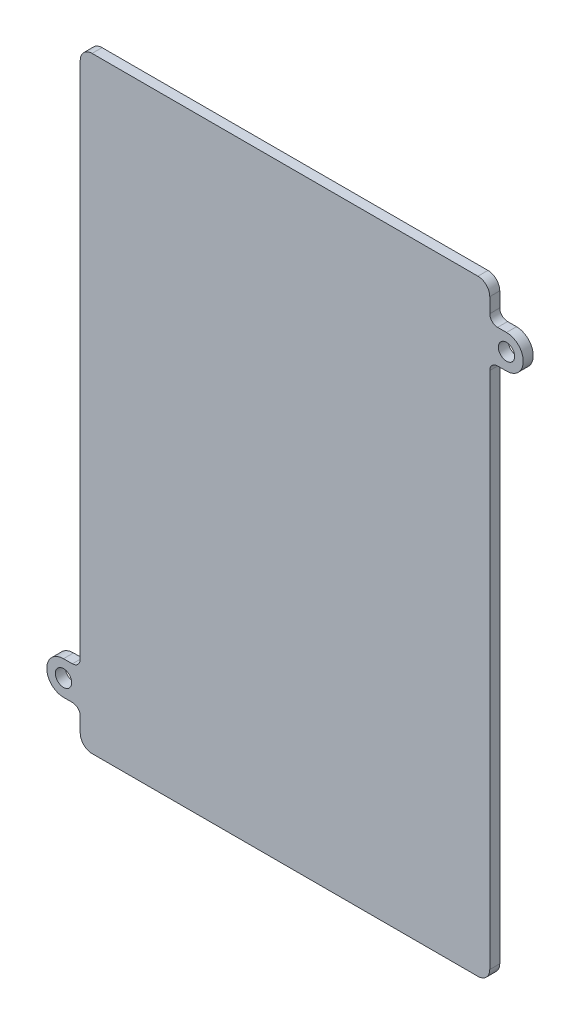
ISO-10303-21;
HEADER;
FILE_DESCRIPTION(('STEP AP214'),'2;1');
FILE_NAME('part.step','',(''),(''),'','','');
FILE_SCHEMA(('AUTOMOTIVE_DESIGN { 1 0 10303 214 1 1 1 1 }'));
ENDSEC;
DATA;
#1=APPLICATION_CONTEXT('core data for automotive mechanical design processes');
#2=APPLICATION_PROTOCOL_DEFINITION('international standard','automotive_design',2000,#1);
#3=PRODUCT_CONTEXT('',#1,'mechanical');
#4=PRODUCT('Part','Part','',(#3));
#5=PRODUCT_RELATED_PRODUCT_CATEGORY('part','',(#4));
#6=PRODUCT_DEFINITION_FORMATION('','',#4);
#7=PRODUCT_DEFINITION_CONTEXT('part definition',#1,'design');
#8=PRODUCT_DEFINITION('design','',#6,#7);
#9=PRODUCT_DEFINITION_SHAPE('','',#8);
#10=(LENGTH_UNIT() NAMED_UNIT(*) SI_UNIT(.MILLI.,.METRE.));
#11=(NAMED_UNIT(*) PLANE_ANGLE_UNIT() SI_UNIT($,.RADIAN.));
#12=(NAMED_UNIT(*) SI_UNIT($,.STERADIAN.) SOLID_ANGLE_UNIT());
#13=UNCERTAINTY_MEASURE_WITH_UNIT(LENGTH_MEASURE(1.E-05),#10,'distance_accuracy_value','');
#14=(GEOMETRIC_REPRESENTATION_CONTEXT(3) GLOBAL_UNCERTAINTY_ASSIGNED_CONTEXT((#13)) GLOBAL_UNIT_ASSIGNED_CONTEXT((#10,
#11,#12)) REPRESENTATION_CONTEXT('',''));
#15=CARTESIAN_POINT('',(0.,0.,0.));
#16=DIRECTION('',(0.,0.,1.));
#17=DIRECTION('',(1.,0.,0.));
#18=AXIS2_PLACEMENT_3D('',#15,#16,#17);
#19=CARTESIAN_POINT('',(49.,-74.,2.54));
#20=DIRECTION('',(0.,0.,-1.));
#21=DIRECTION('',(-1.,0.,0.));
#22=AXIS2_PLACEMENT_3D('',#19,#20,#21);
#23=CYLINDRICAL_SURFACE('',#22,3.);
#24=CARTESIAN_POINT('',(49.,-74.,0.));
#25=DIRECTION('',(0.,0.,1.));
#26=DIRECTION('',(1.,0.,0.));
#27=AXIS2_PLACEMENT_3D('',#24,#25,#26);
#28=CIRCLE('',#27,3.);
#29=CARTESIAN_POINT('',(49.,-77.,0.));
#30=VERTEX_POINT('',#29);
#31=CARTESIAN_POINT('',(52.,-74.,0.));
#32=VERTEX_POINT('',#31);
#33=EDGE_CURVE('E201',#30,#32,#28,.T.);
#34=ORIENTED_EDGE('',*,*,#33,.T.);
#35=DIRECTION('',(0.,0.,-1.));
#36=VECTOR('',#35,1.);
#37=CARTESIAN_POINT('',(52.,-74.,2.54));
#38=LINE('',#37,#36);
#39=CARTESIAN_POINT('',(52.,-74.,2.54));
#40=VERTEX_POINT('',#39);
#41=EDGE_CURVE('E182',#40,#32,#38,.T.);
#42=ORIENTED_EDGE('',*,*,#41,.F.);
#43=CARTESIAN_POINT('',(49.,-74.,2.54));
#44=DIRECTION('',(0.,0.,1.));
#45=DIRECTION('',(1.,0.,0.));
#46=AXIS2_PLACEMENT_3D('',#43,#44,#45);
#47=CIRCLE('',#46,3.);
#48=CARTESIAN_POINT('',(49.,-77.,2.54));
#49=VERTEX_POINT('',#48);
#50=EDGE_CURVE('E188',#49,#40,#47,.T.);
#51=ORIENTED_EDGE('',*,*,#50,.F.);
#52=DIRECTION('',(0.,0.,-1.));
#53=VECTOR('',#52,1.);
#54=CARTESIAN_POINT('',(49.,-77.,2.54));
#55=LINE('',#54,#53);
#56=EDGE_CURVE('E337',#49,#30,#55,.T.);
#57=ORIENTED_EDGE('',*,*,#56,.T.);
#58=EDGE_LOOP('',(#34,#42,#51,#57));
#59=FACE_BOUND('',#58,.T.);
#60=ADVANCED_FACE('F44',(#59),#23,.T.);
#61=CARTESIAN_POINT('',(52.,-74.,2.54));
#62=DIRECTION('',(-1.,0.,0.));
#63=DIRECTION('',(0.,0.,1.));
#64=AXIS2_PLACEMENT_3D('',#61,#62,#63);
#65=PLANE('',#64);
#66=DIRECTION('',(0.,1.,0.));
#67=VECTOR('',#66,1.);
#68=CARTESIAN_POINT('',(52.,-74.,0.));
#69=LINE('',#68,#67);
#70=CARTESIAN_POINT('',(52.,57.75,0.));
#71=VERTEX_POINT('',#70);
#72=EDGE_CURVE('E412',#32,#71,#69,.T.);
#73=ORIENTED_EDGE('',*,*,#72,.T.);
#74=DIRECTION('',(0.,0.,-1.));
#75=VECTOR('',#74,1.);
#76=CARTESIAN_POINT('',(52.,57.75,2.54));
#77=LINE('',#76,#75);
#78=CARTESIAN_POINT('',(52.,57.75,2.54));
#79=VERTEX_POINT('',#78);
#80=EDGE_CURVE('E60',#71,#79,#77,.F.);
#81=ORIENTED_EDGE('',*,*,#80,.T.);
#82=DIRECTION('',(0.,1.,0.));
#83=VECTOR('',#82,1.);
#84=CARTESIAN_POINT('',(52.,-74.,2.54));
#85=LINE('',#84,#83);
#86=EDGE_CURVE('E178',#40,#79,#85,.T.);
#87=ORIENTED_EDGE('',*,*,#86,.F.);
#88=ORIENTED_EDGE('',*,*,#41,.T.);
#89=EDGE_LOOP('',(#73,#81,#87,#88));
#90=FACE_BOUND('',#89,.T.);
#91=ADVANCED_FACE('F180',(#90),#65,.F.);
#92=CARTESIAN_POINT('',(52.,59.75,2.54));
#93=DIRECTION('',(0.,1.,0.));
#94=DIRECTION('',(0.,0.,1.));
#95=AXIS2_PLACEMENT_3D('',#92,#93,#94);
#96=PLANE('',#95);
#97=DIRECTION('',(1.,0.,0.));
#98=VECTOR('',#97,1.);
#99=CARTESIAN_POINT('',(52.,59.75,2.54));
#100=LINE('',#99,#98);
#101=CARTESIAN_POINT('',(54.,59.75,2.54));
#102=VERTEX_POINT('',#101);
#103=CARTESIAN_POINT('',(56.25,59.75,2.54));
#104=VERTEX_POINT('',#103);
#105=EDGE_CURVE('E187',#102,#104,#100,.T.);
#106=ORIENTED_EDGE('',*,*,#105,.F.);
#107=DIRECTION('',(0.,0.,-1.));
#108=VECTOR('',#107,1.);
#109=CARTESIAN_POINT('',(54.,59.75,0.));
#110=LINE('',#109,#108);
#111=CARTESIAN_POINT('',(54.,59.75,0.));
#112=VERTEX_POINT('',#111);
#113=EDGE_CURVE('E241',#102,#112,#110,.T.);
#114=ORIENTED_EDGE('',*,*,#113,.T.);
#115=DIRECTION('',(1.,0.,0.));
#116=VECTOR('',#115,1.);
#117=CARTESIAN_POINT('',(52.,59.75,0.));
#118=LINE('',#117,#116);
#119=CARTESIAN_POINT('',(56.25,59.75,0.));
#120=VERTEX_POINT('',#119);
#121=EDGE_CURVE('E303',#112,#120,#118,.T.);
#122=ORIENTED_EDGE('',*,*,#121,.T.);
#123=DIRECTION('',(0.,0.,-1.));
#124=VECTOR('',#123,1.);
#125=CARTESIAN_POINT('',(56.25,59.75,2.54));
#126=LINE('',#125,#124);
#127=EDGE_CURVE('E204',#104,#120,#126,.T.);
#128=ORIENTED_EDGE('',*,*,#127,.F.);
#129=EDGE_LOOP('',(#106,#114,#122,#128));
#130=FACE_BOUND('',#129,.T.);
#131=ADVANCED_FACE('F416',(#130),#96,.F.);
#132=CARTESIAN_POINT('',(56.25,64.,2.54));
#133=DIRECTION('',(0.,0.,-1.));
#134=DIRECTION('',(-1.,0.,0.));
#135=AXIS2_PLACEMENT_3D('',#132,#133,#134);
#136=CYLINDRICAL_SURFACE('',#135,4.25);
#137=CARTESIAN_POINT('',(56.25,64.,0.));
#138=DIRECTION('',(0.,0.,1.));
#139=DIRECTION('',(1.,0.,0.));
#140=AXIS2_PLACEMENT_3D('',#137,#138,#139);
#141=CIRCLE('',#140,4.25);
#142=CARTESIAN_POINT('',(56.25,68.25,0.));
#143=VERTEX_POINT('',#142);
#144=EDGE_CURVE('E297',#120,#143,#141,.T.);
#145=ORIENTED_EDGE('',*,*,#144,.T.);
#146=DIRECTION('',(0.,0.,-1.));
#147=VECTOR('',#146,1.);
#148=CARTESIAN_POINT('',(56.25,68.25,2.54));
#149=LINE('',#148,#147);
#150=CARTESIAN_POINT('',(56.25,68.25,2.54));
#151=VERTEX_POINT('',#150);
#152=EDGE_CURVE('E212',#151,#143,#149,.T.);
#153=ORIENTED_EDGE('',*,*,#152,.F.);
#154=CARTESIAN_POINT('',(56.25,64.,2.54));
#155=DIRECTION('',(0.,0.,1.));
#156=DIRECTION('',(1.,0.,0.));
#157=AXIS2_PLACEMENT_3D('',#154,#155,#156);
#158=CIRCLE('',#157,4.25);
#159=EDGE_CURVE('E402',#104,#151,#158,.T.);
#160=ORIENTED_EDGE('',*,*,#159,.F.);
#161=ORIENTED_EDGE('',*,*,#127,.T.);
#162=EDGE_LOOP('',(#145,#153,#160,#161));
#163=FACE_BOUND('',#162,.T.);
#164=ADVANCED_FACE('F420',(#163),#136,.T.);
#165=CARTESIAN_POINT('',(56.25,68.25,2.54));
#166=DIRECTION('',(0.,-1.,0.));
#167=DIRECTION('',(0.,0.,-1.));
#168=AXIS2_PLACEMENT_3D('',#165,#166,#167);
#169=PLANE('',#168);
#170=DIRECTION('',(-1.,0.,0.));
#171=VECTOR('',#170,1.);
#172=CARTESIAN_POINT('',(56.25,68.25,0.));
#173=LINE('',#172,#171);
#174=CARTESIAN_POINT('',(54.,68.25,0.));
#175=VERTEX_POINT('',#174);
#176=EDGE_CURVE('E289',#143,#175,#173,.T.);
#177=ORIENTED_EDGE('',*,*,#176,.T.);
#178=DIRECTION('',(0.,0.,-1.));
#179=VECTOR('',#178,1.);
#180=CARTESIAN_POINT('',(54.,68.25,2.54));
#181=LINE('',#180,#179);
#182=CARTESIAN_POINT('',(54.,68.25,2.54));
#183=VERTEX_POINT('',#182);
#184=EDGE_CURVE('E238',#175,#183,#181,.F.);
#185=ORIENTED_EDGE('',*,*,#184,.T.);
#186=DIRECTION('',(-1.,0.,0.));
#187=VECTOR('',#186,1.);
#188=CARTESIAN_POINT('',(56.25,68.25,2.54));
#189=LINE('',#188,#187);
#190=EDGE_CURVE('E271',#151,#183,#189,.T.);
#191=ORIENTED_EDGE('',*,*,#190,.F.);
#192=ORIENTED_EDGE('',*,*,#152,.T.);
#193=EDGE_LOOP('',(#177,#185,#191,#192));
#194=FACE_BOUND('',#193,.T.);
#195=ADVANCED_FACE('F294',(#194),#169,.F.);
#196=CARTESIAN_POINT('',(52.,68.25,2.54));
#197=DIRECTION('',(-1.,0.,0.));
#198=DIRECTION('',(0.,0.,1.));
#199=AXIS2_PLACEMENT_3D('',#196,#197,#198);
#200=PLANE('',#199);
#201=DIRECTION('',(0.,1.,0.));
#202=VECTOR('',#201,1.);
#203=CARTESIAN_POINT('',(52.,68.25,2.54));
#204=LINE('',#203,#202);
#205=CARTESIAN_POINT('',(52.,70.25,2.54));
#206=VERTEX_POINT('',#205);
#207=CARTESIAN_POINT('',(52.,74.,2.54));
#208=VERTEX_POINT('',#207);
#209=EDGE_CURVE('E268',#206,#208,#204,.T.);
#210=ORIENTED_EDGE('',*,*,#209,.F.);
#211=DIRECTION('',(0.,0.,-1.));
#212=VECTOR('',#211,1.);
#213=CARTESIAN_POINT('',(52.,70.25,0.));
#214=LINE('',#213,#212);
#215=CARTESIAN_POINT('',(52.,70.25,0.));
#216=VERTEX_POINT('',#215);
#217=EDGE_CURVE('E234',#206,#216,#214,.T.);
#218=ORIENTED_EDGE('',*,*,#217,.T.);
#219=DIRECTION('',(0.,1.,0.));
#220=VECTOR('',#219,1.);
#221=CARTESIAN_POINT('',(52.,68.25,0.));
#222=LINE('',#221,#220);
#223=CARTESIAN_POINT('',(52.,74.,0.));
#224=VERTEX_POINT('',#223);
#225=EDGE_CURVE('E291',#216,#224,#222,.T.);
#226=ORIENTED_EDGE('',*,*,#225,.T.);
#227=DIRECTION('',(0.,0.,-1.));
#228=VECTOR('',#227,1.);
#229=CARTESIAN_POINT('',(52.,74.,2.54));
#230=LINE('',#229,#228);
#231=EDGE_CURVE('E279',#208,#224,#230,.T.);
#232=ORIENTED_EDGE('',*,*,#231,.F.);
#233=EDGE_LOOP('',(#210,#218,#226,#232));
#234=FACE_BOUND('',#233,.T.);
#235=ADVANCED_FACE('F276',(#234),#200,.F.);
#236=CARTESIAN_POINT('',(49.,74.,2.54));
#237=DIRECTION('',(0.,0.,-1.));
#238=DIRECTION('',(-1.,0.,0.));
#239=AXIS2_PLACEMENT_3D('',#236,#237,#238);
#240=CYLINDRICAL_SURFACE('',#239,3.);
#241=CARTESIAN_POINT('',(49.,74.,0.));
#242=DIRECTION('',(0.,0.,1.));
#243=DIRECTION('',(1.,0.,0.));
#244=AXIS2_PLACEMENT_3D('',#241,#242,#243);
#245=CIRCLE('',#244,3.);
#246=CARTESIAN_POINT('',(49.,77.,0.));
#247=VERTEX_POINT('',#246);
#248=EDGE_CURVE('E301',#224,#247,#245,.T.);
#249=ORIENTED_EDGE('',*,*,#248,.T.);
#250=DIRECTION('',(0.,0.,-1.));
#251=VECTOR('',#250,1.);
#252=CARTESIAN_POINT('',(49.,77.,2.54));
#253=LINE('',#252,#251);
#254=CARTESIAN_POINT('',(49.,77.,2.54));
#255=VERTEX_POINT('',#254);
#256=EDGE_CURVE('E364',#255,#247,#253,.T.);
#257=ORIENTED_EDGE('',*,*,#256,.F.);
#258=CARTESIAN_POINT('',(49.,74.,2.54));
#259=DIRECTION('',(0.,0.,1.));
#260=DIRECTION('',(1.,0.,0.));
#261=AXIS2_PLACEMENT_3D('',#258,#259,#260);
#262=CIRCLE('',#261,3.);
#263=EDGE_CURVE('E282',#208,#255,#262,.T.);
#264=ORIENTED_EDGE('',*,*,#263,.F.);
#265=ORIENTED_EDGE('',*,*,#231,.T.);
#266=EDGE_LOOP('',(#249,#257,#264,#265));
#267=FACE_BOUND('',#266,.T.);
#268=ADVANCED_FACE('F597',(#267),#240,.T.);
#269=CARTESIAN_POINT('',(49.,77.,2.54));
#270=DIRECTION('',(0.,-1.,0.));
#271=DIRECTION('',(0.,0.,-1.));
#272=AXIS2_PLACEMENT_3D('',#269,#270,#271);
#273=PLANE('',#272);
#274=DIRECTION('',(-1.,0.,0.));
#275=VECTOR('',#274,1.);
#276=CARTESIAN_POINT('',(49.,77.,0.));
#277=LINE('',#276,#275);
#278=CARTESIAN_POINT('',(-49.,77.,0.));
#279=VERTEX_POINT('',#278);
#280=EDGE_CURVE('E309',#247,#279,#277,.T.);
#281=ORIENTED_EDGE('',*,*,#280,.T.);
#282=DIRECTION('',(0.,0.,-1.));
#283=VECTOR('',#282,1.);
#284=CARTESIAN_POINT('',(-49.,77.,2.54));
#285=LINE('',#284,#283);
#286=CARTESIAN_POINT('',(-49.,77.,2.54));
#287=VERTEX_POINT('',#286);
#288=EDGE_CURVE('E360',#287,#279,#285,.T.);
#289=ORIENTED_EDGE('',*,*,#288,.F.);
#290=DIRECTION('',(-1.,0.,0.));
#291=VECTOR('',#290,1.);
#292=CARTESIAN_POINT('',(49.,77.,2.54));
#293=LINE('',#292,#291);
#294=EDGE_CURVE('E395',#255,#287,#293,.T.);
#295=ORIENTED_EDGE('',*,*,#294,.F.);
#296=ORIENTED_EDGE('',*,*,#256,.T.);
#297=EDGE_LOOP('',(#281,#289,#295,#296));
#298=FACE_BOUND('',#297,.T.);
#299=ADVANCED_FACE('F587',(#298),#273,.F.);
#300=CARTESIAN_POINT('',(-49.,74.,2.54));
#301=DIRECTION('',(0.,0.,-1.));
#302=DIRECTION('',(-1.,0.,0.));
#303=AXIS2_PLACEMENT_3D('',#300,#301,#302);
#304=CYLINDRICAL_SURFACE('',#303,3.);
#305=CARTESIAN_POINT('',(-49.,74.,0.));
#306=DIRECTION('',(0.,0.,1.));
#307=DIRECTION('',(1.,0.,0.));
#308=AXIS2_PLACEMENT_3D('',#305,#306,#307);
#309=CIRCLE('',#308,3.);
#310=CARTESIAN_POINT('',(-52.,74.,0.));
#311=VERTEX_POINT('',#310);
#312=EDGE_CURVE('E312',#279,#311,#309,.T.);
#313=ORIENTED_EDGE('',*,*,#312,.T.);
#314=DIRECTION('',(0.,0.,-1.));
#315=VECTOR('',#314,1.);
#316=CARTESIAN_POINT('',(-52.,74.,2.54));
#317=LINE('',#316,#315);
#318=CARTESIAN_POINT('',(-52.,74.,2.54));
#319=VERTEX_POINT('',#318);
#320=EDGE_CURVE('E356',#319,#311,#317,.T.);
#321=ORIENTED_EDGE('',*,*,#320,.F.);
#322=CARTESIAN_POINT('',(-49.,74.,2.54));
#323=DIRECTION('',(0.,0.,1.));
#324=DIRECTION('',(1.,0.,0.));
#325=AXIS2_PLACEMENT_3D('',#322,#323,#324);
#326=CIRCLE('',#325,3.);
#327=EDGE_CURVE('E392',#287,#319,#326,.T.);
#328=ORIENTED_EDGE('',*,*,#327,.F.);
#329=ORIENTED_EDGE('',*,*,#288,.T.);
#330=EDGE_LOOP('',(#313,#321,#328,#329));
#331=FACE_BOUND('',#330,.T.);
#332=ADVANCED_FACE('F577',(#331),#304,.T.);
#333=CARTESIAN_POINT('',(-52.,74.,2.54));
#334=DIRECTION('',(1.,0.,0.));
#335=DIRECTION('',(0.,0.,-1.));
#336=AXIS2_PLACEMENT_3D('',#333,#334,#335);
#337=PLANE('',#336);
#338=DIRECTION('',(0.,-1.,0.));
#339=VECTOR('',#338,1.);
#340=CARTESIAN_POINT('',(-52.,74.,0.));
#341=LINE('',#340,#339);
#342=CARTESIAN_POINT('',(-52.,-57.75,0.));
#343=VERTEX_POINT('',#342);
#344=EDGE_CURVE('E315',#311,#343,#341,.T.);
#345=ORIENTED_EDGE('',*,*,#344,.T.);
#346=DIRECTION('',(0.,0.,-1.));
#347=VECTOR('',#346,1.);
#348=CARTESIAN_POINT('',(-52.,-57.75,2.54));
#349=LINE('',#348,#347);
#350=CARTESIAN_POINT('',(-52.,-57.75,2.54));
#351=VERTEX_POINT('',#350);
#352=EDGE_CURVE('E231',#343,#351,#349,.F.);
#353=ORIENTED_EDGE('',*,*,#352,.T.);
#354=DIRECTION('',(0.,-1.,0.));
#355=VECTOR('',#354,1.);
#356=CARTESIAN_POINT('',(-52.,74.,2.54));
#357=LINE('',#356,#355);
#358=EDGE_CURVE('E388',#319,#351,#357,.T.);
#359=ORIENTED_EDGE('',*,*,#358,.F.);
#360=ORIENTED_EDGE('',*,*,#320,.T.);
#361=EDGE_LOOP('',(#345,#353,#359,#360));
#362=FACE_BOUND('',#361,.T.);
#363=ADVANCED_FACE('F567',(#362),#337,.F.);
#364=CARTESIAN_POINT('',(-52.,-59.75,2.54));
#365=DIRECTION('',(0.,-1.,0.));
#366=DIRECTION('',(1.,0.,0.));
#367=AXIS2_PLACEMENT_3D('',#364,#365,#366);
#368=PLANE('',#367);
#369=DIRECTION('',(-1.,0.,0.));
#370=VECTOR('',#369,1.);
#371=CARTESIAN_POINT('',(-52.,-59.75,2.54));
#372=LINE('',#371,#370);
#373=CARTESIAN_POINT('',(-54.,-59.75,2.54));
#374=VERTEX_POINT('',#373);
#375=CARTESIAN_POINT('',(-56.25,-59.75,2.54));
#376=VERTEX_POINT('',#375);
#377=EDGE_CURVE('E385',#374,#376,#372,.T.);
#378=ORIENTED_EDGE('',*,*,#377,.F.);
#379=DIRECTION('',(0.,0.,-1.));
#380=VECTOR('',#379,1.);
#381=CARTESIAN_POINT('',(-54.,-59.75,0.));
#382=LINE('',#381,#380);
#383=CARTESIAN_POINT('',(-54.,-59.75,0.));
#384=VERTEX_POINT('',#383);
#385=EDGE_CURVE('E227',#374,#384,#382,.T.);
#386=ORIENTED_EDGE('',*,*,#385,.T.);
#387=DIRECTION('',(-1.,0.,0.));
#388=VECTOR('',#387,1.);
#389=CARTESIAN_POINT('',(-52.,-59.75,0.));
#390=LINE('',#389,#388);
#391=CARTESIAN_POINT('',(-56.25,-59.75,0.));
#392=VERTEX_POINT('',#391);
#393=EDGE_CURVE('E319',#384,#392,#390,.T.);
#394=ORIENTED_EDGE('',*,*,#393,.T.);
#395=DIRECTION('',(0.,0.,-1.));
#396=VECTOR('',#395,1.);
#397=CARTESIAN_POINT('',(-56.25,-59.75,2.54));
#398=LINE('',#397,#396);
#399=EDGE_CURVE('E352',#376,#392,#398,.T.);
#400=ORIENTED_EDGE('',*,*,#399,.F.);
#401=EDGE_LOOP('',(#378,#386,#394,#400));
#402=FACE_BOUND('',#401,.T.);
#403=ADVANCED_FACE('F557',(#402),#368,.F.);
#404=CARTESIAN_POINT('',(-56.25,-64.,2.54));
#405=DIRECTION('',(0.,0.,-1.));
#406=DIRECTION('',(-1.,0.,0.));
#407=AXIS2_PLACEMENT_3D('',#404,#405,#406);
#408=CYLINDRICAL_SURFACE('',#407,4.25);
#409=CARTESIAN_POINT('',(-56.25,-64.,0.));
#410=DIRECTION('',(0.,0.,1.));
#411=DIRECTION('',(1.,0.,0.));
#412=AXIS2_PLACEMENT_3D('',#409,#410,#411);
#413=CIRCLE('',#412,4.25);
#414=CARTESIAN_POINT('',(-56.25,-68.25,0.));
#415=VERTEX_POINT('',#414);
#416=EDGE_CURVE('E322',#392,#415,#413,.T.);
#417=ORIENTED_EDGE('',*,*,#416,.T.);
#418=DIRECTION('',(0.,0.,-1.));
#419=VECTOR('',#418,1.);
#420=CARTESIAN_POINT('',(-56.25,-68.25,2.54));
#421=LINE('',#420,#419);
#422=CARTESIAN_POINT('',(-56.25,-68.25,2.54));
#423=VERTEX_POINT('',#422);
#424=EDGE_CURVE('E348',#423,#415,#421,.T.);
#425=ORIENTED_EDGE('',*,*,#424,.F.);
#426=CARTESIAN_POINT('',(-56.25,-64.,2.54));
#427=DIRECTION('',(0.,0.,1.));
#428=DIRECTION('',(1.,0.,0.));
#429=AXIS2_PLACEMENT_3D('',#426,#427,#428);
#430=CIRCLE('',#429,4.25);
#431=EDGE_CURVE('E382',#376,#423,#430,.T.);
#432=ORIENTED_EDGE('',*,*,#431,.F.);
#433=ORIENTED_EDGE('',*,*,#399,.T.);
#434=EDGE_LOOP('',(#417,#425,#432,#433));
#435=FACE_BOUND('',#434,.T.);
#436=ADVANCED_FACE('F547',(#435),#408,.T.);
#437=CARTESIAN_POINT('',(-56.25,-68.25,2.54));
#438=DIRECTION('',(0.,1.,0.));
#439=DIRECTION('',(-1.,0.,0.));
#440=AXIS2_PLACEMENT_3D('',#437,#438,#439);
#441=PLANE('',#440);
#442=DIRECTION('',(1.,0.,0.));
#443=VECTOR('',#442,1.);
#444=CARTESIAN_POINT('',(-56.25,-68.25,0.));
#445=LINE('',#444,#443);
#446=CARTESIAN_POINT('',(-54.,-68.25,0.));
#447=VERTEX_POINT('',#446);
#448=EDGE_CURVE('E325',#415,#447,#445,.T.);
#449=ORIENTED_EDGE('',*,*,#448,.T.);
#450=DIRECTION('',(0.,0.,-1.));
#451=VECTOR('',#450,1.);
#452=CARTESIAN_POINT('',(-54.,-68.25,2.54));
#453=LINE('',#452,#451);
#454=CARTESIAN_POINT('',(-54.,-68.25,2.54));
#455=VERTEX_POINT('',#454);
#456=EDGE_CURVE('E209',#447,#455,#453,.F.);
#457=ORIENTED_EDGE('',*,*,#456,.T.);
#458=DIRECTION('',(1.,0.,0.));
#459=VECTOR('',#458,1.);
#460=CARTESIAN_POINT('',(-56.25,-68.25,2.54));
#461=LINE('',#460,#459);
#462=EDGE_CURVE('E378',#423,#455,#461,.T.);
#463=ORIENTED_EDGE('',*,*,#462,.F.);
#464=ORIENTED_EDGE('',*,*,#424,.T.);
#465=EDGE_LOOP('',(#449,#457,#463,#464));
#466=FACE_BOUND('',#465,.T.);
#467=ADVANCED_FACE('F537',(#466),#441,.F.);
#468=CARTESIAN_POINT('',(-52.,-68.25,2.54));
#469=DIRECTION('',(1.,0.,0.));
#470=DIRECTION('',(0.,0.,-1.));
#471=AXIS2_PLACEMENT_3D('',#468,#469,#470);
#472=PLANE('',#471);
#473=DIRECTION('',(0.,-1.,0.));
#474=VECTOR('',#473,1.);
#475=CARTESIAN_POINT('',(-52.,-68.25,2.54));
#476=LINE('',#475,#474);
#477=CARTESIAN_POINT('',(-52.,-70.25,2.54));
#478=VERTEX_POINT('',#477);
#479=CARTESIAN_POINT('',(-52.,-74.,2.54));
#480=VERTEX_POINT('',#479);
#481=EDGE_CURVE('E375',#478,#480,#476,.T.);
#482=ORIENTED_EDGE('',*,*,#481,.F.);
#483=DIRECTION('',(0.,0.,-1.));
#484=VECTOR('',#483,1.);
#485=CARTESIAN_POINT('',(-52.,-70.25,0.));
#486=LINE('',#485,#484);
#487=CARTESIAN_POINT('',(-52.,-70.25,0.));
#488=VERTEX_POINT('',#487);
#489=EDGE_CURVE('E203',#478,#488,#486,.T.);
#490=ORIENTED_EDGE('',*,*,#489,.T.);
#491=DIRECTION('',(0.,-1.,0.));
#492=VECTOR('',#491,1.);
#493=CARTESIAN_POINT('',(-52.,-68.25,0.));
#494=LINE('',#493,#492);
#495=CARTESIAN_POINT('',(-52.,-74.,0.));
#496=VERTEX_POINT('',#495);
#497=EDGE_CURVE('E329',#488,#496,#494,.T.);
#498=ORIENTED_EDGE('',*,*,#497,.T.);
#499=DIRECTION('',(0.,0.,-1.));
#500=VECTOR('',#499,1.);
#501=CARTESIAN_POINT('',(-52.,-74.,2.54));
#502=LINE('',#501,#500);
#503=EDGE_CURVE('E344',#480,#496,#502,.T.);
#504=ORIENTED_EDGE('',*,*,#503,.F.);
#505=EDGE_LOOP('',(#482,#490,#498,#504));
#506=FACE_BOUND('',#505,.T.);
#507=ADVANCED_FACE('F527',(#506),#472,.F.);
#508=CARTESIAN_POINT('',(-49.,-74.,2.54));
#509=DIRECTION('',(0.,0.,-1.));
#510=DIRECTION('',(-1.,0.,0.));
#511=AXIS2_PLACEMENT_3D('',#508,#509,#510);
#512=CYLINDRICAL_SURFACE('',#511,3.);
#513=CARTESIAN_POINT('',(-49.,-74.,0.));
#514=DIRECTION('',(0.,0.,1.));
#515=DIRECTION('',(1.,0.,0.));
#516=AXIS2_PLACEMENT_3D('',#513,#514,#515);
#517=CIRCLE('',#516,3.);
#518=CARTESIAN_POINT('',(-49.,-77.,0.));
#519=VERTEX_POINT('',#518);
#520=EDGE_CURVE('E332',#496,#519,#517,.T.);
#521=ORIENTED_EDGE('',*,*,#520,.T.);
#522=DIRECTION('',(0.,0.,-1.));
#523=VECTOR('',#522,1.);
#524=CARTESIAN_POINT('',(-49.,-77.,2.54));
#525=LINE('',#524,#523);
#526=CARTESIAN_POINT('',(-49.,-77.,2.54));
#527=VERTEX_POINT('',#526);
#528=EDGE_CURVE('E340',#527,#519,#525,.T.);
#529=ORIENTED_EDGE('',*,*,#528,.F.);
#530=CARTESIAN_POINT('',(-49.,-74.,2.54));
#531=DIRECTION('',(0.,0.,1.));
#532=DIRECTION('',(1.,0.,0.));
#533=AXIS2_PLACEMENT_3D('',#530,#531,#532);
#534=CIRCLE('',#533,3.);
#535=EDGE_CURVE('E372',#480,#527,#534,.T.);
#536=ORIENTED_EDGE('',*,*,#535,.F.);
#537=ORIENTED_EDGE('',*,*,#503,.T.);
#538=EDGE_LOOP('',(#521,#529,#536,#537));
#539=FACE_BOUND('',#538,.T.);
#540=ADVANCED_FACE('F517',(#539),#512,.T.);
#541=CARTESIAN_POINT('',(-49.,-77.,2.54));
#542=DIRECTION('',(0.,1.,0.));
#543=DIRECTION('',(0.,0.,1.));
#544=AXIS2_PLACEMENT_3D('',#541,#542,#543);
#545=PLANE('',#544);
#546=DIRECTION('',(1.,0.,0.));
#547=VECTOR('',#546,1.);
#548=CARTESIAN_POINT('',(-49.,-77.,0.));
#549=LINE('',#548,#547);
#550=EDGE_CURVE('E198',#519,#30,#549,.T.);
#551=ORIENTED_EDGE('',*,*,#550,.T.);
#552=ORIENTED_EDGE('',*,*,#56,.F.);
#553=DIRECTION('',(1.,0.,0.));
#554=VECTOR('',#553,1.);
#555=CARTESIAN_POINT('',(-49.,-77.,2.54));
#556=LINE('',#555,#554);
#557=EDGE_CURVE('E193',#527,#49,#556,.T.);
#558=ORIENTED_EDGE('',*,*,#557,.F.);
#559=ORIENTED_EDGE('',*,*,#528,.T.);
#560=EDGE_LOOP('',(#551,#552,#558,#559));
#561=FACE_BOUND('',#560,.T.);
#562=ADVANCED_FACE('F507',(#561),#545,.F.);
#563=CARTESIAN_POINT('',(49.,-74.,2.54));
#564=DIRECTION('',(0.,0.,1.));
#565=DIRECTION('',(1.,0.,0.));
#566=AXIS2_PLACEMENT_3D('',#563,#564,#565);
#567=PLANE('',#566);
#568=CARTESIAN_POINT('',(56.25,64.,2.54));
#569=DIRECTION('',(0.,0.,1.));
#570=DIRECTION('',(1.,0.,0.));
#571=AXIS2_PLACEMENT_3D('',#568,#569,#570);
#572=CIRCLE('',#571,2.075);
#573=CARTESIAN_POINT('',(58.325,64.,2.54));
#574=VERTEX_POINT('',#573);
#575=EDGE_CURVE('E221',#574,#574,#572,.T.);
#576=ORIENTED_EDGE('',*,*,#575,.F.);
#577=EDGE_LOOP('',(#576));
#578=FACE_BOUND('',#577,.T.);
#579=CARTESIAN_POINT('',(-56.25,-64.,2.54));
#580=DIRECTION('',(0.,0.,1.));
#581=DIRECTION('',(1.,0.,0.));
#582=AXIS2_PLACEMENT_3D('',#579,#580,#581);
#583=CIRCLE('',#582,2.075);
#584=CARTESIAN_POINT('',(-54.175,-64.,2.54));
#585=VERTEX_POINT('',#584);
#586=EDGE_CURVE('E677',#585,#585,#583,.T.);
#587=ORIENTED_EDGE('',*,*,#586,.F.);
#588=EDGE_LOOP('',(#587));
#589=FACE_BOUND('',#588,.T.);
#590=ORIENTED_EDGE('',*,*,#50,.T.);
#591=ORIENTED_EDGE('',*,*,#86,.T.);
#592=CARTESIAN_POINT('',(54.,57.75,2.54));
#593=DIRECTION('',(0.,0.,1.));
#594=DIRECTION('',(1.,0.,0.));
#595=AXIS2_PLACEMENT_3D('',#592,#593,#594);
#596=CIRCLE('',#595,2.);
#597=EDGE_CURVE('E11',#79,#102,#596,.F.);
#598=ORIENTED_EDGE('',*,*,#597,.T.);
#599=ORIENTED_EDGE('',*,*,#105,.T.);
#600=ORIENTED_EDGE('',*,*,#159,.T.);
#601=ORIENTED_EDGE('',*,*,#190,.T.);
#602=CARTESIAN_POINT('',(54.,70.25,2.54));
#603=DIRECTION('',(0.,0.,1.));
#604=DIRECTION('',(1.,0.,0.));
#605=AXIS2_PLACEMENT_3D('',#602,#603,#604);
#606=CIRCLE('',#605,2.);
#607=EDGE_CURVE('E262',#183,#206,#606,.F.);
#608=ORIENTED_EDGE('',*,*,#607,.T.);
#609=ORIENTED_EDGE('',*,*,#209,.T.);
#610=ORIENTED_EDGE('',*,*,#263,.T.);
#611=ORIENTED_EDGE('',*,*,#294,.T.);
#612=ORIENTED_EDGE('',*,*,#327,.T.);
#613=ORIENTED_EDGE('',*,*,#358,.T.);
#614=CARTESIAN_POINT('',(-54.,-57.75,2.54));
#615=DIRECTION('',(0.,0.,1.));
#616=DIRECTION('',(1.,0.,0.));
#617=AXIS2_PLACEMENT_3D('',#614,#615,#616);
#618=CIRCLE('',#617,2.);
#619=EDGE_CURVE('E256',#351,#374,#618,.F.);
#620=ORIENTED_EDGE('',*,*,#619,.T.);
#621=ORIENTED_EDGE('',*,*,#377,.T.);
#622=ORIENTED_EDGE('',*,*,#431,.T.);
#623=ORIENTED_EDGE('',*,*,#462,.T.);
#624=CARTESIAN_POINT('',(-54.,-70.25,2.54));
#625=DIRECTION('',(0.,0.,1.));
#626=DIRECTION('',(1.,0.,0.));
#627=AXIS2_PLACEMENT_3D('',#624,#625,#626);
#628=CIRCLE('',#627,2.);
#629=EDGE_CURVE('E250',#455,#478,#628,.F.);
#630=ORIENTED_EDGE('',*,*,#629,.T.);
#631=ORIENTED_EDGE('',*,*,#481,.T.);
#632=ORIENTED_EDGE('',*,*,#535,.T.);
#633=ORIENTED_EDGE('',*,*,#557,.T.);
#634=EDGE_LOOP('',(#590,#591,#598,#599,#600,#601,#608,#609,#610,#611,#612,#613,#620,#621,#622,
#623,#630,#631,#632,#633));
#635=FACE_BOUND('',#634,.T.);
#636=ADVANCED_FACE('F191',(#578,#589,#635),#567,.T.);
#637=CARTESIAN_POINT('',(49.,-74.,0.));
#638=DIRECTION('',(0.,0.,1.));
#639=DIRECTION('',(1.,0.,0.));
#640=AXIS2_PLACEMENT_3D('',#637,#638,#639);
#641=PLANE('',#640);
#642=CARTESIAN_POINT('',(56.25,64.,0.));
#643=DIRECTION('',(0.,0.,1.));
#644=DIRECTION('',(1.,0.,0.));
#645=AXIS2_PLACEMENT_3D('',#642,#643,#644);
#646=CIRCLE('',#645,2.075);
#647=CARTESIAN_POINT('',(58.325,64.,0.));
#648=VERTEX_POINT('',#647);
#649=EDGE_CURVE('E220',#648,#648,#646,.T.);
#650=ORIENTED_EDGE('',*,*,#649,.T.);
#651=EDGE_LOOP('',(#650));
#652=FACE_BOUND('',#651,.T.);
#653=CARTESIAN_POINT('',(-56.25,-64.,0.));
#654=DIRECTION('',(0.,0.,1.));
#655=DIRECTION('',(1.,0.,0.));
#656=AXIS2_PLACEMENT_3D('',#653,#654,#655);
#657=CIRCLE('',#656,2.075);
#658=CARTESIAN_POINT('',(-54.175,-64.,0.));
#659=VERTEX_POINT('',#658);
#660=EDGE_CURVE('E216',#659,#659,#657,.T.);
#661=ORIENTED_EDGE('',*,*,#660,.T.);
#662=EDGE_LOOP('',(#661));
#663=FACE_BOUND('',#662,.T.);
#664=ORIENTED_EDGE('',*,*,#33,.F.);
#665=ORIENTED_EDGE('',*,*,#550,.F.);
#666=ORIENTED_EDGE('',*,*,#520,.F.);
#667=ORIENTED_EDGE('',*,*,#497,.F.);
#668=CARTESIAN_POINT('',(-54.,-70.25,0.));
#669=DIRECTION('',(0.,0.,1.));
#670=DIRECTION('',(1.,0.,0.));
#671=AXIS2_PLACEMENT_3D('',#668,#669,#670);
#672=CIRCLE('',#671,2.);
#673=EDGE_CURVE('E247',#488,#447,#672,.T.);
#674=ORIENTED_EDGE('',*,*,#673,.T.);
#675=ORIENTED_EDGE('',*,*,#448,.F.);
#676=ORIENTED_EDGE('',*,*,#416,.F.);
#677=ORIENTED_EDGE('',*,*,#393,.F.);
#678=CARTESIAN_POINT('',(-54.,-57.75,0.));
#679=DIRECTION('',(0.,0.,1.));
#680=DIRECTION('',(1.,0.,0.));
#681=AXIS2_PLACEMENT_3D('',#678,#679,#680);
#682=CIRCLE('',#681,2.);
#683=EDGE_CURVE('E253',#384,#343,#682,.T.);
#684=ORIENTED_EDGE('',*,*,#683,.T.);
#685=ORIENTED_EDGE('',*,*,#344,.F.);
#686=ORIENTED_EDGE('',*,*,#312,.F.);
#687=ORIENTED_EDGE('',*,*,#280,.F.);
#688=ORIENTED_EDGE('',*,*,#248,.F.);
#689=ORIENTED_EDGE('',*,*,#225,.F.);
#690=CARTESIAN_POINT('',(54.,70.25,0.));
#691=DIRECTION('',(0.,0.,1.));
#692=DIRECTION('',(1.,0.,0.));
#693=AXIS2_PLACEMENT_3D('',#690,#691,#692);
#694=CIRCLE('',#693,2.);
#695=EDGE_CURVE('E259',#216,#175,#694,.T.);
#696=ORIENTED_EDGE('',*,*,#695,.T.);
#697=ORIENTED_EDGE('',*,*,#176,.F.);
#698=ORIENTED_EDGE('',*,*,#144,.F.);
#699=ORIENTED_EDGE('',*,*,#121,.F.);
#700=CARTESIAN_POINT('',(54.,57.75,0.));
#701=DIRECTION('',(0.,0.,1.));
#702=DIRECTION('',(1.,0.,0.));
#703=AXIS2_PLACEMENT_3D('',#700,#701,#702);
#704=CIRCLE('',#703,2.);
#705=EDGE_CURVE('E53',#112,#71,#704,.T.);
#706=ORIENTED_EDGE('',*,*,#705,.T.);
#707=ORIENTED_EDGE('',*,*,#72,.F.);
#708=EDGE_LOOP('',(#664,#665,#666,#667,#674,#675,#676,#677,#684,#685,#686,#687,#688,#689,#696,
#697,#698,#699,#706,#707));
#709=FACE_BOUND('',#708,.T.);
#710=ADVANCED_FACE('F287',(#652,#663,#709),#641,.F.);
#711=CARTESIAN_POINT('',(-56.25,-64.,-7.46));
#712=DIRECTION('',(0.,0.,1.));
#713=DIRECTION('',(1.,0.,0.));
#714=AXIS2_PLACEMENT_3D('',#711,#712,#713);
#715=CYLINDRICAL_SURFACE('',#714,2.075);
#716=ORIENTED_EDGE('',*,*,#586,.T.);
#717=EDGE_LOOP('',(#716));
#718=FACE_BOUND('',#717,.T.);
#719=ORIENTED_EDGE('',*,*,#660,.F.);
#720=EDGE_LOOP('',(#719));
#721=FACE_BOUND('',#720,.T.);
#722=ADVANCED_FACE('F479',(#718,#721),#715,.F.);
#723=CARTESIAN_POINT('',(56.25,64.,-7.46));
#724=DIRECTION('',(0.,0.,1.));
#725=DIRECTION('',(1.,0.,0.));
#726=AXIS2_PLACEMENT_3D('',#723,#724,#725);
#727=CYLINDRICAL_SURFACE('',#726,2.075);
#728=ORIENTED_EDGE('',*,*,#575,.T.);
#729=EDGE_LOOP('',(#728));
#730=FACE_BOUND('',#729,.T.);
#731=ORIENTED_EDGE('',*,*,#649,.F.);
#732=EDGE_LOOP('',(#731));
#733=FACE_BOUND('',#732,.T.);
#734=ADVANCED_FACE('F441',(#730,#733),#727,.F.);
#735=CARTESIAN_POINT('',(-54.,-70.25,2.54));
#736=DIRECTION('',(0.,0.,1.));
#737=DIRECTION('',(1.,0.,0.));
#738=AXIS2_PLACEMENT_3D('',#735,#736,#737);
#739=CYLINDRICAL_SURFACE('',#738,2.);
#740=ORIENTED_EDGE('',*,*,#629,.F.);
#741=ORIENTED_EDGE('',*,*,#456,.F.);
#742=ORIENTED_EDGE('',*,*,#673,.F.);
#743=ORIENTED_EDGE('',*,*,#489,.F.);
#744=EDGE_LOOP('',(#740,#741,#742,#743));
#745=FACE_BOUND('',#744,.T.);
#746=ADVANCED_FACE('F437',(#745),#739,.F.);
#747=CARTESIAN_POINT('',(-54.,-57.75,2.54));
#748=DIRECTION('',(0.,0.,1.));
#749=DIRECTION('',(1.,0.,0.));
#750=AXIS2_PLACEMENT_3D('',#747,#748,#749);
#751=CYLINDRICAL_SURFACE('',#750,2.);
#752=ORIENTED_EDGE('',*,*,#619,.F.);
#753=ORIENTED_EDGE('',*,*,#352,.F.);
#754=ORIENTED_EDGE('',*,*,#683,.F.);
#755=ORIENTED_EDGE('',*,*,#385,.F.);
#756=EDGE_LOOP('',(#752,#753,#754,#755));
#757=FACE_BOUND('',#756,.T.);
#758=ADVANCED_FACE('F440',(#757),#751,.F.);
#759=CARTESIAN_POINT('',(54.,70.25,2.54));
#760=DIRECTION('',(0.,0.,1.));
#761=DIRECTION('',(1.,0.,0.));
#762=AXIS2_PLACEMENT_3D('',#759,#760,#761);
#763=CYLINDRICAL_SURFACE('',#762,2.);
#764=ORIENTED_EDGE('',*,*,#607,.F.);
#765=ORIENTED_EDGE('',*,*,#184,.F.);
#766=ORIENTED_EDGE('',*,*,#695,.F.);
#767=ORIENTED_EDGE('',*,*,#217,.F.);
#768=EDGE_LOOP('',(#764,#765,#766,#767));
#769=FACE_BOUND('',#768,.T.);
#770=ADVANCED_FACE('F284',(#769),#763,.F.);
#771=CARTESIAN_POINT('',(54.,57.75,2.54));
#772=DIRECTION('',(0.,0.,1.));
#773=DIRECTION('',(1.,0.,0.));
#774=AXIS2_PLACEMENT_3D('',#771,#772,#773);
#775=CYLINDRICAL_SURFACE('',#774,2.);
#776=ORIENTED_EDGE('',*,*,#597,.F.);
#777=ORIENTED_EDGE('',*,*,#80,.F.);
#778=ORIENTED_EDGE('',*,*,#705,.F.);
#779=ORIENTED_EDGE('',*,*,#113,.F.);
#780=EDGE_LOOP('',(#776,#777,#778,#779));
#781=FACE_BOUND('',#780,.T.);
#782=ADVANCED_FACE('F46',(#781),#775,.F.);
#783=CLOSED_SHELL('',(#60,#91,#131,#164,#195,#235,#268,#299,#332,#363,#403,#436,#467,#507,#540,
#562,#636,#710,#722,#734,#746,#758,#770,#782));
#784=MANIFOLD_SOLID_BREP('B2',#783);
#785=ADVANCED_BREP_SHAPE_REPRESENTATION('',(#18,#784),#14);
#786=SHAPE_DEFINITION_REPRESENTATION(#9,#785);
ENDSEC;
END-ISO-10303-21;
